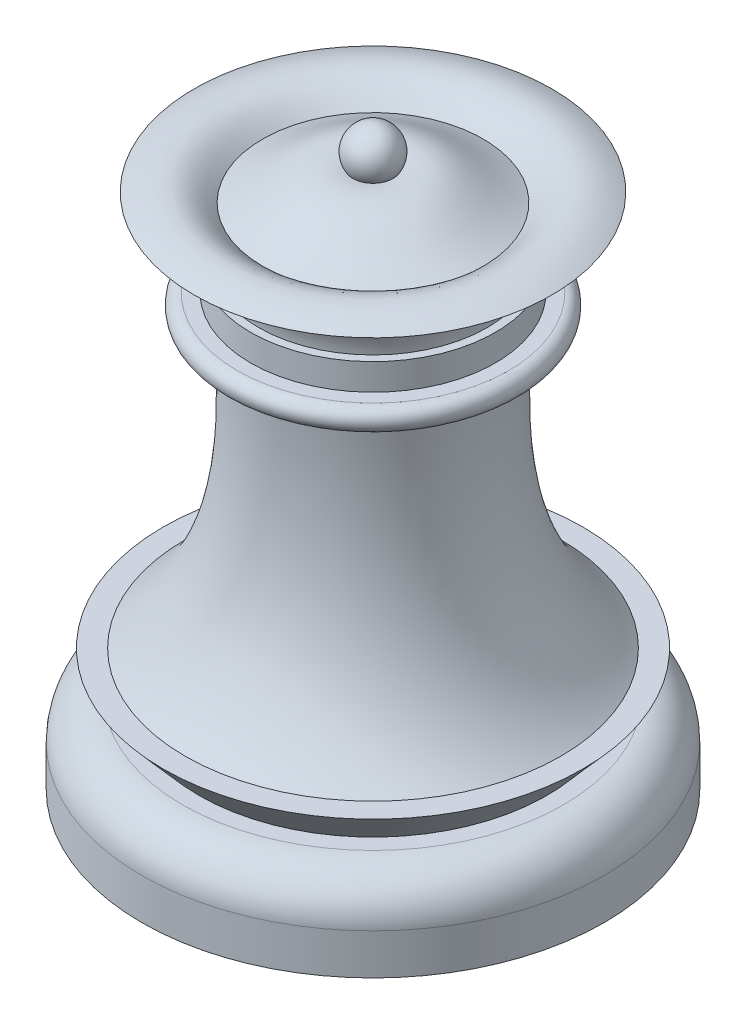
ISO-10303-21;
HEADER;
FILE_DESCRIPTION(('STEP AP214'),'2;1');
FILE_NAME('part.step','',(''),(''),'','','');
FILE_SCHEMA(('AUTOMOTIVE_DESIGN { 1 0 10303 214 1 1 1 1 }'));
ENDSEC;
DATA;
#1=APPLICATION_CONTEXT('core data for automotive mechanical design processes');
#2=APPLICATION_PROTOCOL_DEFINITION('international standard','automotive_design',2000,#1);
#3=PRODUCT_CONTEXT('',#1,'mechanical');
#4=PRODUCT('Part','Part','',(#3));
#5=PRODUCT_RELATED_PRODUCT_CATEGORY('part','',(#4));
#6=PRODUCT_DEFINITION_FORMATION('','',#4);
#7=PRODUCT_DEFINITION_CONTEXT('part definition',#1,'design');
#8=PRODUCT_DEFINITION('design','',#6,#7);
#9=PRODUCT_DEFINITION_SHAPE('','',#8);
#10=(LENGTH_UNIT() NAMED_UNIT(*) SI_UNIT(.MILLI.,.METRE.));
#11=(NAMED_UNIT(*) PLANE_ANGLE_UNIT() SI_UNIT($,.RADIAN.));
#12=(NAMED_UNIT(*) SI_UNIT($,.STERADIAN.) SOLID_ANGLE_UNIT());
#13=UNCERTAINTY_MEASURE_WITH_UNIT(LENGTH_MEASURE(1.E-05),#10,'distance_accuracy_value','');
#14=(GEOMETRIC_REPRESENTATION_CONTEXT(3) GLOBAL_UNCERTAINTY_ASSIGNED_CONTEXT((#13)) GLOBAL_UNIT_ASSIGNED_CONTEXT((#10,
#11,#12)) REPRESENTATION_CONTEXT('',''));
#15=CARTESIAN_POINT('',(0.,0.,0.));
#16=DIRECTION('',(0.,0.,1.));
#17=DIRECTION('',(1.,0.,0.));
#18=AXIS2_PLACEMENT_3D('',#15,#16,#17);
#19=CARTESIAN_POINT('',(0.,5.,0.));
#20=DIRECTION('',(0.,1.,0.));
#21=DIRECTION('',(0.,0.,1.));
#22=AXIS2_PLACEMENT_3D('',#19,#20,#21);
#23=TOROIDAL_SURFACE('',#22,23.3192016359149,5.);
#24=CARTESIAN_POINT('',(0.,10.,0.));
#25=DIRECTION('',(0.,1.,0.));
#26=DIRECTION('',(0.,0.,1.));
#27=AXIS2_PLACEMENT_3D('',#24,#25,#26);
#28=CIRCLE('',#27,23.3192016359149);
#29=CARTESIAN_POINT('',(0.,10.,23.3192016359149));
#30=VERTEX_POINT('',#29);
#31=EDGE_CURVE('E43',#30,#30,#28,.T.);
#32=ORIENTED_EDGE('',*,*,#31,.F.);
#33=EDGE_LOOP('',(#32));
#34=FACE_BOUND('',#33,.T.);
#35=CARTESIAN_POINT('',(0.,5.,0.));
#36=DIRECTION('',(0.,1.,0.));
#37=DIRECTION('',(0.,0.,1.));
#38=AXIS2_PLACEMENT_3D('',#35,#36,#37);
#39=CIRCLE('',#38,28.3192016359149);
#40=CARTESIAN_POINT('',(0.,5.,28.3192016359149));
#41=VERTEX_POINT('',#40);
#42=EDGE_CURVE('E10',#41,#41,#39,.F.);
#43=ORIENTED_EDGE('',*,*,#42,.F.);
#44=EDGE_LOOP('',(#43));
#45=FACE_BOUND('',#44,.T.);
#46=ADVANCED_FACE('F37',(#34,#45),#23,.T.);
#47=CARTESIAN_POINT('',(0.,51.3730058561625,0.));
#48=DIRECTION('',(0.,1.,0.));
#49=DIRECTION('',(0.,0.,1.));
#50=AXIS2_PLACEMENT_3D('',#47,#48,#49);
#51=TOROIDAL_SURFACE('',#50,16.6269941438375,1.37300585616245);
#52=CARTESIAN_POINT('',(0.,52.7460117123249,0.));
#53=DIRECTION('',(0.,1.,0.));
#54=DIRECTION('',(0.,0.,1.));
#55=AXIS2_PLACEMENT_3D('',#52,#53,#54);
#56=CIRCLE('',#55,16.6269941438375);
#57=CARTESIAN_POINT('',(0.,52.7460117123249,16.6269941438375));
#58=VERTEX_POINT('',#57);
#59=EDGE_CURVE('E51',#58,#58,#56,.T.);
#60=ORIENTED_EDGE('',*,*,#59,.F.);
#61=EDGE_LOOP('',(#60));
#62=FACE_BOUND('',#61,.T.);
#63=CARTESIAN_POINT('',(0.,50.,0.));
#64=DIRECTION('',(0.,-1.,0.));
#65=DIRECTION('',(0.,0.,-1.));
#66=AXIS2_PLACEMENT_3D('',#63,#64,#65);
#67=CIRCLE('',#66,16.6269941438375);
#68=CARTESIAN_POINT('',(0.,50.,-16.6269941438375));
#69=VERTEX_POINT('',#68);
#70=EDGE_CURVE('E47',#69,#69,#67,.T.);
#71=ORIENTED_EDGE('',*,*,#70,.F.);
#72=EDGE_LOOP('',(#71));
#73=FACE_BOUND('',#72,.T.);
#74=ADVANCED_FACE('F151',(#62,#73),#51,.T.);
#75=CARTESIAN_POINT('',(0.,67.6828584408,0.));
#76=DIRECTION('',(0.,1.,0.));
#77=DIRECTION('',(1.,0.,0.));
#78=AXIS2_PLACEMENT_3D('',#75,#76,#77);
#79=SPHERICAL_SURFACE('',#78,2.94900672283228);
#80=CARTESIAN_POINT('',(0.,66.051109586741,0.));
#81=DIRECTION('',(0.,1.,0.));
#82=DIRECTION('',(0.,0.,1.));
#83=AXIS2_PLACEMENT_3D('',#80,#81,#82);
#84=CIRCLE('',#83,2.45642755410924);
#85=CARTESIAN_POINT('',(0.,66.051109586741,2.45642755410924));
#86=VERTEX_POINT('',#85);
#87=EDGE_CURVE('E56',#86,#86,#84,.T.);
#88=ORIENTED_EDGE('',*,*,#87,.T.);
#89=EDGE_LOOP('',(#88));
#90=FACE_BOUND('',#89,.T.);
#91=ADVANCED_FACE('F148',(#90),#79,.T.);
#92=CARTESIAN_POINT('',(-2.45642755410924,66.051109586741,0.));
#93=CARTESIAN_POINT('',(-7.2125514694017,66.9205284459532,0.));
#94=CARTESIAN_POINT('',(-8.66481347872318,64.2988400804686,0.));
#95=CARTESIAN_POINT('',(-13.5116188628051,62.2674584121401,0.));
#96=B_SPLINE_CURVE_WITH_KNOTS('',3,(#92,#93,#94,#95),.UNSPECIFIED.,.F.,.F.,(4,4),(0.,
0.620902488982124),.UNSPECIFIED.);
#97=CARTESIAN_POINT('',(0.,70.6318651636323,0.));
#98=DIRECTION('',(0.,1.,0.));
#99=AXIS1_PLACEMENT('',#97,#98);
#100=SURFACE_OF_REVOLUTION('',#96,#99);
#101=CARTESIAN_POINT('',(0.,62.2674584121401,0.));
#102=DIRECTION('',(0.,1.,0.));
#103=DIRECTION('',(0.,0.,1.));
#104=AXIS2_PLACEMENT_3D('',#101,#102,#103);
#105=CIRCLE('',#104,13.5116188628051);
#106=CARTESIAN_POINT('',(0.,62.2674584121401,13.5116188628051));
#107=VERTEX_POINT('',#106);
#108=EDGE_CURVE('E59',#107,#107,#105,.T.);
#109=ORIENTED_EDGE('',*,*,#108,.T.);
#110=EDGE_LOOP('',(#109));
#111=FACE_BOUND('',#110,.T.);
#112=ORIENTED_EDGE('',*,*,#87,.F.);
#113=EDGE_LOOP('',(#112));
#114=FACE_BOUND('',#113,.T.);
#115=ADVANCED_FACE('F131',(#111,#114),#100,.F.);
#116=CARTESIAN_POINT('',(-13.5116188628051,62.2674584121401,0.));
#117=CARTESIAN_POINT('',(-15.6739353078076,64.2216393625149,0.));
#118=CARTESIAN_POINT('',(-17.4934201582789,65.5344775326172,0.));
#119=CARTESIAN_POINT('',(-21.9054889071175,63.4046924181438,0.));
#120=B_SPLINE_CURVE_WITH_KNOTS('',3,(#116,#117,#118,#119),.UNSPECIFIED.,.F.,.F.,(4,4),(0.,1.),.UNSPECIFIED.);
#121=CARTESIAN_POINT('',(0.,70.6318651636323,0.));
#122=DIRECTION('',(0.,1.,0.));
#123=AXIS1_PLACEMENT('',#121,#122);
#124=SURFACE_OF_REVOLUTION('',#120,#123);
#125=CARTESIAN_POINT('',(0.,63.4046924181438,0.));
#126=DIRECTION('',(0.,1.,0.));
#127=DIRECTION('',(0.,0.,1.));
#128=AXIS2_PLACEMENT_3D('',#125,#126,#127);
#129=CIRCLE('',#128,21.9054889071175);
#130=CARTESIAN_POINT('',(0.,63.4046924181438,21.9054889071175));
#131=VERTEX_POINT('',#130);
#132=EDGE_CURVE('E62',#131,#131,#129,.T.);
#133=ORIENTED_EDGE('',*,*,#132,.T.);
#134=EDGE_LOOP('',(#133));
#135=FACE_BOUND('',#134,.T.);
#136=ORIENTED_EDGE('',*,*,#108,.F.);
#137=EDGE_LOOP('',(#136));
#138=FACE_BOUND('',#137,.T.);
#139=ADVANCED_FACE('F127',(#135,#138),#124,.F.);
#140=CARTESIAN_POINT('',(-21.9054889071175,63.4046924181438,0.));
#141=CARTESIAN_POINT('',(-17.0705902580073,63.9320653401668,0.));
#142=CARTESIAN_POINT('',(-14.1618617272761,59.6537156601758,0.));
#143=CARTESIAN_POINT('',(-14.,55.9960117123249,0.));
#144=B_SPLINE_CURVE_WITH_KNOTS('',3,(#140,#141,#142,#143),.UNSPECIFIED.,.F.,.F.,(4,4),(0.,1.),.UNSPECIFIED.);
#145=CARTESIAN_POINT('',(0.,70.6318651636323,0.));
#146=DIRECTION('',(0.,1.,0.));
#147=AXIS1_PLACEMENT('',#145,#146);
#148=SURFACE_OF_REVOLUTION('',#144,#147);
#149=CARTESIAN_POINT('',(0.,55.9960117123249,0.));
#150=DIRECTION('',(0.,1.,0.));
#151=DIRECTION('',(0.,0.,1.));
#152=AXIS2_PLACEMENT_3D('',#149,#150,#151);
#153=CIRCLE('',#152,14.);
#154=CARTESIAN_POINT('',(0.,55.9960117123249,14.));
#155=VERTEX_POINT('',#154);
#156=EDGE_CURVE('E65',#155,#155,#153,.T.);
#157=ORIENTED_EDGE('',*,*,#156,.T.);
#158=EDGE_LOOP('',(#157));
#159=FACE_BOUND('',#158,.T.);
#160=ORIENTED_EDGE('',*,*,#132,.F.);
#161=EDGE_LOOP('',(#160));
#162=FACE_BOUND('',#161,.T.);
#163=ADVANCED_FACE('F123',(#159,#162),#148,.F.);
#164=CARTESIAN_POINT('',(-15.,55.9960117123249,0.));
#165=DIRECTION('',(0.,1.,0.));
#166=DIRECTION('',(0.,0.,1.));
#167=AXIS2_PLACEMENT_3D('',#164,#165,#166);
#168=PLANE('',#167);
#169=CARTESIAN_POINT('',(0.,55.9960117123249,0.));
#170=DIRECTION('',(0.,1.,0.));
#171=DIRECTION('',(0.,0.,1.));
#172=AXIS2_PLACEMENT_3D('',#169,#170,#171);
#173=CIRCLE('',#172,15.);
#174=CARTESIAN_POINT('',(0.,55.9960117123249,15.));
#175=VERTEX_POINT('',#174);
#176=EDGE_CURVE('E68',#175,#175,#173,.T.);
#177=ORIENTED_EDGE('',*,*,#176,.T.);
#178=EDGE_LOOP('',(#177));
#179=FACE_BOUND('',#178,.T.);
#180=ORIENTED_EDGE('',*,*,#156,.F.);
#181=EDGE_LOOP('',(#180));
#182=FACE_BOUND('',#181,.T.);
#183=ADVANCED_FACE('F119',(#179,#182),#168,.T.);
#184=CARTESIAN_POINT('',(0.,70.6318651636323,0.));
#185=DIRECTION('',(0.,1.,0.));
#186=DIRECTION('',(0.,0.,1.));
#187=AXIS2_PLACEMENT_3D('',#184,#185,#186);
#188=CYLINDRICAL_SURFACE('',#187,15.);
#189=CARTESIAN_POINT('',(0.,52.7460117123249,0.));
#190=DIRECTION('',(0.,1.,0.));
#191=DIRECTION('',(0.,0.,1.));
#192=AXIS2_PLACEMENT_3D('',#189,#190,#191);
#193=CIRCLE('',#192,15.);
#194=CARTESIAN_POINT('',(0.,52.7460117123249,15.));
#195=VERTEX_POINT('',#194);
#196=EDGE_CURVE('E71',#195,#195,#193,.T.);
#197=ORIENTED_EDGE('',*,*,#196,.T.);
#198=EDGE_LOOP('',(#197));
#199=FACE_BOUND('',#198,.T.);
#200=ORIENTED_EDGE('',*,*,#176,.F.);
#201=EDGE_LOOP('',(#200));
#202=FACE_BOUND('',#201,.T.);
#203=ADVANCED_FACE('F115',(#199,#202),#188,.T.);
#204=CARTESIAN_POINT('',(-18.,52.7460117123249,0.));
#205=DIRECTION('',(0.,1.,0.));
#206=DIRECTION('',(0.,0.,1.));
#207=AXIS2_PLACEMENT_3D('',#204,#205,#206);
#208=PLANE('',#207);
#209=ORIENTED_EDGE('',*,*,#59,.T.);
#210=EDGE_LOOP('',(#209));
#211=FACE_BOUND('',#210,.T.);
#212=ORIENTED_EDGE('',*,*,#196,.F.);
#213=EDGE_LOOP('',(#212));
#214=FACE_BOUND('',#213,.T.);
#215=ADVANCED_FACE('F111',(#211,#214),#208,.T.);
#216=CARTESIAN_POINT('',(-14.,50.,0.));
#217=DIRECTION('',(0.,-1.,0.));
#218=DIRECTION('',(0.,0.,-1.));
#219=AXIS2_PLACEMENT_3D('',#216,#217,#218);
#220=PLANE('',#219);
#221=ORIENTED_EDGE('',*,*,#70,.T.);
#222=EDGE_LOOP('',(#221));
#223=FACE_BOUND('',#222,.T.);
#224=CARTESIAN_POINT('',(0.,50.,0.));
#225=DIRECTION('',(0.,1.,0.));
#226=DIRECTION('',(0.,0.,1.));
#227=AXIS2_PLACEMENT_3D('',#224,#225,#226);
#228=CIRCLE('',#227,14.);
#229=CARTESIAN_POINT('',(0.,50.,14.));
#230=VERTEX_POINT('',#229);
#231=EDGE_CURVE('E74',#230,#230,#228,.T.);
#232=ORIENTED_EDGE('',*,*,#231,.T.);
#233=EDGE_LOOP('',(#232));
#234=FACE_BOUND('',#233,.T.);
#235=ADVANCED_FACE('F106',(#223,#234),#220,.T.);
#236=CARTESIAN_POINT('',(-14.,50.,0.));
#237=CARTESIAN_POINT('',(-11.5494436089191,24.7438701754823,0.));
#238=CARTESIAN_POINT('',(-23.,15.,0.));
#239=B_SPLINE_CURVE_WITH_KNOTS('',2,(#236,#237,#238),.UNSPECIFIED.,.F.,.F.,(3,3),(0.,
0.88944569725833),.UNSPECIFIED.);
#240=CARTESIAN_POINT('',(0.,70.6318651636323,0.));
#241=DIRECTION('',(0.,1.,0.));
#242=AXIS1_PLACEMENT('',#240,#241);
#243=SURFACE_OF_REVOLUTION('',#239,#242);
#244=CARTESIAN_POINT('',(0.,15.,0.));
#245=DIRECTION('',(0.,1.,0.));
#246=DIRECTION('',(0.,0.,1.));
#247=AXIS2_PLACEMENT_3D('',#244,#245,#246);
#248=CIRCLE('',#247,23.);
#249=CARTESIAN_POINT('',(0.,15.,23.));
#250=VERTEX_POINT('',#249);
#251=EDGE_CURVE('E77',#250,#250,#248,.T.);
#252=ORIENTED_EDGE('',*,*,#251,.T.);
#253=EDGE_LOOP('',(#252));
#254=FACE_BOUND('',#253,.T.);
#255=ORIENTED_EDGE('',*,*,#231,.F.);
#256=EDGE_LOOP('',(#255));
#257=FACE_BOUND('',#256,.T.);
#258=ADVANCED_FACE('F101',(#254,#257),#243,.F.);
#259=CARTESIAN_POINT('',(-23.,15.,0.));
#260=DIRECTION('',(0.,1.,0.));
#261=DIRECTION('',(0.,0.,1.));
#262=AXIS2_PLACEMENT_3D('',#259,#260,#261);
#263=PLANE('',#262);
#264=CARTESIAN_POINT('',(0.,15.,0.));
#265=DIRECTION('',(0.,1.,0.));
#266=DIRECTION('',(0.,0.,1.));
#267=AXIS2_PLACEMENT_3D('',#264,#265,#266);
#268=CIRCLE('',#267,25.70187);
#269=CARTESIAN_POINT('',(0.,15.,25.70187));
#270=VERTEX_POINT('',#269);
#271=EDGE_CURVE('E80',#270,#270,#268,.T.);
#272=ORIENTED_EDGE('',*,*,#271,.T.);
#273=EDGE_LOOP('',(#272));
#274=FACE_BOUND('',#273,.T.);
#275=ORIENTED_EDGE('',*,*,#251,.F.);
#276=EDGE_LOOP('',(#275));
#277=FACE_BOUND('',#276,.T.);
#278=ADVANCED_FACE('F105',(#274,#277),#263,.T.);
#279=CARTESIAN_POINT('',(0.,15.,0.));
#280=DIRECTION('',(0.,1.,0.));
#281=DIRECTION('',(0.,0.,1.));
#282=AXIS2_PLACEMENT_3D('',#279,#280,#281);
#283=CONICAL_SURFACE('',#282,25.70187,0.71969792737676);
#284=CARTESIAN_POINT('',(0.,10.,0.));
#285=DIRECTION('',(0.,1.,0.));
#286=DIRECTION('',(0.,0.,1.));
#287=AXIS2_PLACEMENT_3D('',#284,#285,#286);
#288=CIRCLE('',#287,21.319202);
#289=CARTESIAN_POINT('',(0.,10.,21.319202));
#290=VERTEX_POINT('',#289);
#291=EDGE_CURVE('E83',#290,#290,#288,.T.);
#292=ORIENTED_EDGE('',*,*,#291,.T.);
#293=EDGE_LOOP('',(#292));
#294=FACE_BOUND('',#293,.T.);
#295=ORIENTED_EDGE('',*,*,#271,.F.);
#296=EDGE_LOOP('',(#295));
#297=FACE_BOUND('',#296,.T.);
#298=ADVANCED_FACE('F200',(#294,#297),#283,.T.);
#299=CARTESIAN_POINT('',(-28.3192016359149,10.,0.));
#300=DIRECTION('',(0.,1.,0.));
#301=DIRECTION('',(0.,0.,1.));
#302=AXIS2_PLACEMENT_3D('',#299,#300,#301);
#303=PLANE('',#302);
#304=ORIENTED_EDGE('',*,*,#31,.T.);
#305=EDGE_LOOP('',(#304));
#306=FACE_BOUND('',#305,.T.);
#307=ORIENTED_EDGE('',*,*,#291,.F.);
#308=EDGE_LOOP('',(#307));
#309=FACE_BOUND('',#308,.T.);
#310=ADVANCED_FACE('F194',(#306,#309),#303,.T.);
#311=CARTESIAN_POINT('',(0.,70.6318651636323,0.));
#312=DIRECTION('',(0.,1.,0.));
#313=DIRECTION('',(0.,0.,1.));
#314=AXIS2_PLACEMENT_3D('',#311,#312,#313);
#315=CYLINDRICAL_SURFACE('',#314,28.3192016359149);
#316=ORIENTED_EDGE('',*,*,#42,.T.);
#317=EDGE_LOOP('',(#316));
#318=FACE_BOUND('',#317,.T.);
#319=CARTESIAN_POINT('',(0.,0.,0.));
#320=DIRECTION('',(0.,1.,0.));
#321=DIRECTION('',(0.,0.,1.));
#322=AXIS2_PLACEMENT_3D('',#319,#320,#321);
#323=CIRCLE('',#322,28.3192016359149);
#324=CARTESIAN_POINT('',(0.,0.,28.3192016359149));
#325=VERTEX_POINT('',#324);
#326=EDGE_CURVE('E86',#325,#325,#323,.T.);
#327=ORIENTED_EDGE('',*,*,#326,.T.);
#328=EDGE_LOOP('',(#327));
#329=FACE_BOUND('',#328,.T.);
#330=ADVANCED_FACE('F199',(#318,#329),#315,.T.);
#331=CARTESIAN_POINT('',(0.,0.,0.));
#332=DIRECTION('',(0.,-1.,0.));
#333=DIRECTION('',(0.,0.,-1.));
#334=AXIS2_PLACEMENT_3D('',#331,#332,#333);
#335=PLANE('',#334);
#336=ORIENTED_EDGE('',*,*,#326,.F.);
#337=EDGE_LOOP('',(#336));
#338=FACE_BOUND('',#337,.T.);
#339=ADVANCED_FACE('F211',(#338),#335,.T.);
#340=CLOSED_SHELL('',(#46,#74,#91,#115,#139,#163,#183,#203,#215,#235,#258,#278,#298,#310,#330,#339));
#341=MANIFOLD_SOLID_BREP('B2',#340);
#342=ADVANCED_BREP_SHAPE_REPRESENTATION('',(#18,#341),#14);
#343=SHAPE_DEFINITION_REPRESENTATION(#9,#342);
ENDSEC;
END-ISO-10303-21;
